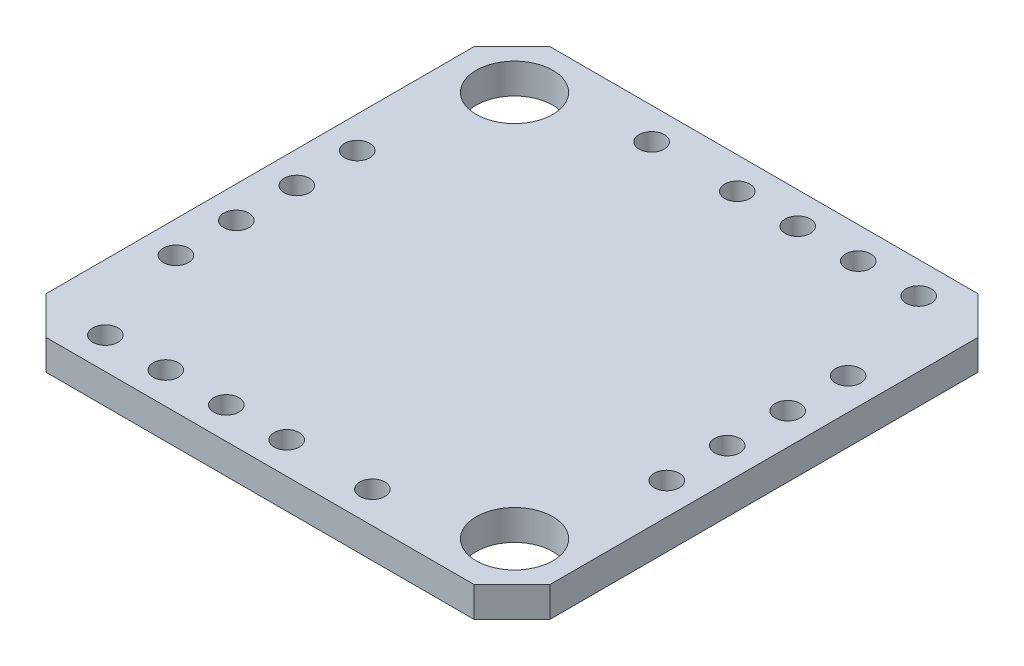
ISO-10303-21;
HEADER;
FILE_DESCRIPTION(('STEP AP214'),'2;1');
FILE_NAME('part.step','',(''),(''),'','','');
FILE_SCHEMA(('AUTOMOTIVE_DESIGN { 1 0 10303 214 1 1 1 1 }'));
ENDSEC;
DATA;
#1=APPLICATION_CONTEXT('core data for automotive mechanical design processes');
#2=APPLICATION_PROTOCOL_DEFINITION('international standard','automotive_design',2000,#1);
#3=PRODUCT_CONTEXT('',#1,'mechanical');
#4=PRODUCT('Part','Part','',(#3));
#5=PRODUCT_RELATED_PRODUCT_CATEGORY('part','',(#4));
#6=PRODUCT_DEFINITION_FORMATION('','',#4);
#7=PRODUCT_DEFINITION_CONTEXT('part definition',#1,'design');
#8=PRODUCT_DEFINITION('design','',#6,#7);
#9=PRODUCT_DEFINITION_SHAPE('','',#8);
#10=(LENGTH_UNIT() NAMED_UNIT(*) SI_UNIT(.MILLI.,.METRE.));
#11=(NAMED_UNIT(*) PLANE_ANGLE_UNIT() SI_UNIT($,.RADIAN.));
#12=(NAMED_UNIT(*) SI_UNIT($,.STERADIAN.) SOLID_ANGLE_UNIT());
#13=UNCERTAINTY_MEASURE_WITH_UNIT(LENGTH_MEASURE(1.E-05),#10,'distance_accuracy_value','');
#14=(GEOMETRIC_REPRESENTATION_CONTEXT(3) GLOBAL_UNCERTAINTY_ASSIGNED_CONTEXT((#13)) GLOBAL_UNIT_ASSIGNED_CONTEXT((#10,
#11,#12)) REPRESENTATION_CONTEXT('',''));
#15=CARTESIAN_POINT('',(0.,0.,0.));
#16=DIRECTION('',(0.,0.,1.));
#17=DIRECTION('',(1.,0.,0.));
#18=AXIS2_PLACEMENT_3D('',#15,#16,#17);
#19=CARTESIAN_POINT('',(5.,0.6,5.));
#20=DIRECTION('',(-1.,0.,0.));
#21=DIRECTION('',(0.,0.,1.));
#22=AXIS2_PLACEMENT_3D('',#19,#20,#21);
#23=PLANE('',#22);
#24=DIRECTION('',(0.,0.,-1.));
#25=VECTOR('',#24,1.);
#26=CARTESIAN_POINT('',(5.,0.6,5.));
#27=LINE('',#26,#25);
#28=CARTESIAN_POINT('',(5.,0.6,4.25));
#29=VERTEX_POINT('',#28);
#30=CARTESIAN_POINT('',(5.,0.6,-4.25));
#31=VERTEX_POINT('',#30);
#32=EDGE_CURVE('E126',#29,#31,#27,.T.);
#33=ORIENTED_EDGE('',*,*,#32,.F.);
#34=DIRECTION('',(0.,-1.,0.));
#35=VECTOR('',#34,1.);
#36=CARTESIAN_POINT('',(5.,0.6,4.25));
#37=LINE('',#36,#35);
#38=CARTESIAN_POINT('',(5.,0.,4.25));
#39=VERTEX_POINT('',#38);
#40=EDGE_CURVE('E152',#29,#39,#37,.T.);
#41=ORIENTED_EDGE('',*,*,#40,.T.);
#42=DIRECTION('',(0.,0.,-1.));
#43=VECTOR('',#42,1.);
#44=CARTESIAN_POINT('',(5.,0.,5.));
#45=LINE('',#44,#43);
#46=CARTESIAN_POINT('',(5.,0.,-4.25));
#47=VERTEX_POINT('',#46);
#48=EDGE_CURVE('E158',#39,#47,#45,.T.);
#49=ORIENTED_EDGE('',*,*,#48,.T.);
#50=DIRECTION('',(0.,1.,0.));
#51=VECTOR('',#50,1.);
#52=CARTESIAN_POINT('',(5.,0.6,-4.25));
#53=LINE('',#52,#51);
#54=EDGE_CURVE('E150',#47,#31,#53,.T.);
#55=ORIENTED_EDGE('',*,*,#54,.T.);
#56=EDGE_LOOP('',(#33,#41,#49,#55));
#57=FACE_BOUND('',#56,.T.);
#58=ADVANCED_FACE('F34',(#57),#23,.F.);
#59=CARTESIAN_POINT('',(-5.,0.6,-5.));
#60=DIRECTION('',(0.,0.,1.));
#61=DIRECTION('',(1.,0.,0.));
#62=AXIS2_PLACEMENT_3D('',#59,#60,#61);
#63=PLANE('',#62);
#64=DIRECTION('',(-1.,0.,0.));
#65=VECTOR('',#64,1.);
#66=CARTESIAN_POINT('',(-5.,0.6,-5.));
#67=LINE('',#66,#65);
#68=CARTESIAN_POINT('',(4.25,0.6,-5.));
#69=VERTEX_POINT('',#68);
#70=CARTESIAN_POINT('',(-4.24999999999999,0.6,-5.));
#71=VERTEX_POINT('',#70);
#72=EDGE_CURVE('E129',#69,#71,#67,.T.);
#73=ORIENTED_EDGE('',*,*,#72,.F.);
#74=DIRECTION('',(0.,-1.,0.));
#75=VECTOR('',#74,1.);
#76=CARTESIAN_POINT('',(4.25,0.6,-5.));
#77=LINE('',#76,#75);
#78=CARTESIAN_POINT('',(4.25,0.,-5.));
#79=VERTEX_POINT('',#78);
#80=EDGE_CURVE('E11',#69,#79,#77,.T.);
#81=ORIENTED_EDGE('',*,*,#80,.T.);
#82=DIRECTION('',(-1.,0.,0.));
#83=VECTOR('',#82,1.);
#84=CARTESIAN_POINT('',(-5.,0.,-5.));
#85=LINE('',#84,#83);
#86=CARTESIAN_POINT('',(-4.24999999999999,0.,-5.));
#87=VERTEX_POINT('',#86);
#88=EDGE_CURVE('E131',#79,#87,#85,.T.);
#89=ORIENTED_EDGE('',*,*,#88,.T.);
#90=DIRECTION('',(0.,1.,0.));
#91=VECTOR('',#90,1.);
#92=CARTESIAN_POINT('',(-4.24999999999999,0.6,-5.));
#93=LINE('',#92,#91);
#94=EDGE_CURVE('E42',#87,#71,#93,.T.);
#95=ORIENTED_EDGE('',*,*,#94,.T.);
#96=EDGE_LOOP('',(#73,#81,#89,#95));
#97=FACE_BOUND('',#96,.T.);
#98=ADVANCED_FACE('F347',(#97),#63,.F.);
#99=CARTESIAN_POINT('',(-5.,0.6,5.));
#100=DIRECTION('',(1.,0.,0.));
#101=DIRECTION('',(0.,0.,-1.));
#102=AXIS2_PLACEMENT_3D('',#99,#100,#101);
#103=PLANE('',#102);
#104=DIRECTION('',(0.,0.,1.));
#105=VECTOR('',#104,1.);
#106=CARTESIAN_POINT('',(-5.,0.,5.));
#107=LINE('',#106,#105);
#108=CARTESIAN_POINT('',(-5.,0.,-4.25));
#109=VERTEX_POINT('',#108);
#110=CARTESIAN_POINT('',(-5.,0.,4.25));
#111=VERTEX_POINT('',#110);
#112=EDGE_CURVE('E127',#109,#111,#107,.T.);
#113=ORIENTED_EDGE('',*,*,#112,.T.);
#114=DIRECTION('',(0.,1.,0.));
#115=VECTOR('',#114,1.);
#116=CARTESIAN_POINT('',(-5.,0.6,4.25));
#117=LINE('',#116,#115);
#118=CARTESIAN_POINT('',(-5.,0.6,4.25));
#119=VERTEX_POINT('',#118);
#120=EDGE_CURVE('E105',#111,#119,#117,.T.);
#121=ORIENTED_EDGE('',*,*,#120,.T.);
#122=DIRECTION('',(0.,0.,1.));
#123=VECTOR('',#122,1.);
#124=CARTESIAN_POINT('',(-5.,0.6,5.));
#125=LINE('',#124,#123);
#126=CARTESIAN_POINT('',(-5.,0.6,-4.25));
#127=VERTEX_POINT('',#126);
#128=EDGE_CURVE('E170',#127,#119,#125,.T.);
#129=ORIENTED_EDGE('',*,*,#128,.F.);
#130=DIRECTION('',(0.,-1.,0.));
#131=VECTOR('',#130,1.);
#132=CARTESIAN_POINT('',(-5.,0.6,-4.25));
#133=LINE('',#132,#131);
#134=EDGE_CURVE('E110',#127,#109,#133,.T.);
#135=ORIENTED_EDGE('',*,*,#134,.T.);
#136=EDGE_LOOP('',(#113,#121,#129,#135));
#137=FACE_BOUND('',#136,.T.);
#138=ADVANCED_FACE('F345',(#137),#103,.F.);
#139=CARTESIAN_POINT('',(-5.,0.6,5.));
#140=DIRECTION('',(0.,0.,-1.));
#141=DIRECTION('',(-1.,0.,0.));
#142=AXIS2_PLACEMENT_3D('',#139,#140,#141);
#143=PLANE('',#142);
#144=DIRECTION('',(1.,0.,0.));
#145=VECTOR('',#144,1.);
#146=CARTESIAN_POINT('',(-5.,0.6,5.));
#147=LINE('',#146,#145);
#148=CARTESIAN_POINT('',(-4.25,0.6,5.));
#149=VERTEX_POINT('',#148);
#150=CARTESIAN_POINT('',(4.25,0.6,5.));
#151=VERTEX_POINT('',#150);
#152=EDGE_CURVE('E120',#149,#151,#147,.T.);
#153=ORIENTED_EDGE('',*,*,#152,.F.);
#154=DIRECTION('',(0.,-1.,0.));
#155=VECTOR('',#154,1.);
#156=CARTESIAN_POINT('',(-4.25,0.6,5.));
#157=LINE('',#156,#155);
#158=CARTESIAN_POINT('',(-4.25,0.,5.));
#159=VERTEX_POINT('',#158);
#160=EDGE_CURVE('E104',#149,#159,#157,.T.);
#161=ORIENTED_EDGE('',*,*,#160,.T.);
#162=DIRECTION('',(1.,0.,0.));
#163=VECTOR('',#162,1.);
#164=CARTESIAN_POINT('',(-5.,0.,5.));
#165=LINE('',#164,#163);
#166=CARTESIAN_POINT('',(4.25,0.,5.));
#167=VERTEX_POINT('',#166);
#168=EDGE_CURVE('E117',#159,#167,#165,.T.);
#169=ORIENTED_EDGE('',*,*,#168,.T.);
#170=DIRECTION('',(0.,1.,0.));
#171=VECTOR('',#170,1.);
#172=CARTESIAN_POINT('',(4.25,0.6,5.));
#173=LINE('',#172,#171);
#174=EDGE_CURVE('E122',#167,#151,#173,.T.);
#175=ORIENTED_EDGE('',*,*,#174,.T.);
#176=EDGE_LOOP('',(#153,#161,#169,#175));
#177=FACE_BOUND('',#176,.T.);
#178=ADVANCED_FACE('F116',(#177),#143,.F.);
#179=CARTESIAN_POINT('',(0.,0.6,0.));
#180=DIRECTION('',(0.,-1.,0.));
#181=DIRECTION('',(0.,0.,-1.));
#182=AXIS2_PLACEMENT_3D('',#179,#180,#181);
#183=PLANE('',#182);
#184=CARTESIAN_POINT('',(4.3718272,0.6,1.3));
#185=DIRECTION('',(0.,1.,0.));
#186=DIRECTION('',(0.,0.,1.));
#187=AXIS2_PLACEMENT_3D('',#184,#185,#186);
#188=CIRCLE('',#187,0.25);
#189=CARTESIAN_POINT('',(4.3718272,0.6,1.55));
#190=VERTEX_POINT('',#189);
#191=EDGE_CURVE('E270',#190,#190,#188,.T.);
#192=ORIENTED_EDGE('',*,*,#191,.F.);
#193=EDGE_LOOP('',(#192));
#194=FACE_BOUND('',#193,.T.);
#195=CARTESIAN_POINT('',(4.3718272,0.6,-1.1));
#196=DIRECTION('',(0.,1.,0.));
#197=DIRECTION('',(0.,0.,1.));
#198=AXIS2_PLACEMENT_3D('',#195,#196,#197);
#199=CIRCLE('',#198,0.25);
#200=CARTESIAN_POINT('',(4.3718272,0.6,-0.849999999999999));
#201=VERTEX_POINT('',#200);
#202=EDGE_CURVE('E280',#201,#201,#199,.T.);
#203=ORIENTED_EDGE('',*,*,#202,.F.);
#204=EDGE_LOOP('',(#203));
#205=FACE_BOUND('',#204,.T.);
#206=CARTESIAN_POINT('',(4.3718272,0.6,-2.3));
#207=DIRECTION('',(0.,1.,0.));
#208=DIRECTION('',(0.,0.,1.));
#209=AXIS2_PLACEMENT_3D('',#206,#207,#208);
#210=CIRCLE('',#209,0.25);
#211=CARTESIAN_POINT('',(4.3718272,0.6,-2.05));
#212=VERTEX_POINT('',#211);
#213=EDGE_CURVE('E273',#212,#212,#210,.T.);
#214=ORIENTED_EDGE('',*,*,#213,.F.);
#215=EDGE_LOOP('',(#214));
#216=FACE_BOUND('',#215,.T.);
#217=CARTESIAN_POINT('',(4.3718272,0.6,0.1));
#218=DIRECTION('',(0.,1.,0.));
#219=DIRECTION('',(0.,0.,1.));
#220=AXIS2_PLACEMENT_3D('',#217,#218,#219);
#221=CIRCLE('',#220,0.25);
#222=CARTESIAN_POINT('',(4.3718272,0.6,0.35));
#223=VERTEX_POINT('',#222);
#224=EDGE_CURVE('E264',#223,#223,#221,.T.);
#225=ORIENTED_EDGE('',*,*,#224,.F.);
#226=EDGE_LOOP('',(#225));
#227=FACE_BOUND('',#226,.T.);
#228=CARTESIAN_POINT('',(-1.6,0.6,-4.3718272));
#229=DIRECTION('',(0.,1.,0.));
#230=DIRECTION('',(0.,0.,1.));
#231=AXIS2_PLACEMENT_3D('',#228,#229,#230);
#232=CIRCLE('',#231,0.25);
#233=CARTESIAN_POINT('',(-1.6,0.6,-4.1218272));
#234=VERTEX_POINT('',#233);
#235=EDGE_CURVE('E258',#234,#234,#232,.T.);
#236=ORIENTED_EDGE('',*,*,#235,.F.);
#237=EDGE_LOOP('',(#236));
#238=FACE_BOUND('',#237,.T.);
#239=CARTESIAN_POINT('',(1.6,0.6,4.3718272));
#240=DIRECTION('',(0.,1.,0.));
#241=DIRECTION('',(0.,0.,1.));
#242=AXIS2_PLACEMENT_3D('',#239,#240,#241);
#243=CIRCLE('',#242,0.25);
#244=CARTESIAN_POINT('',(1.6,0.6,4.6218272));
#245=VERTEX_POINT('',#244);
#246=EDGE_CURVE('E244',#245,#245,#243,.T.);
#247=ORIENTED_EDGE('',*,*,#246,.F.);
#248=EDGE_LOOP('',(#247));
#249=FACE_BOUND('',#248,.T.);
#250=CARTESIAN_POINT('',(3.7,0.6,-4.3718272));
#251=DIRECTION('',(0.,1.,0.));
#252=DIRECTION('',(0.,0.,1.));
#253=AXIS2_PLACEMENT_3D('',#250,#251,#252);
#254=CIRCLE('',#253,0.25);
#255=CARTESIAN_POINT('',(3.7,0.6,-4.1218272));
#256=VERTEX_POINT('',#255);
#257=EDGE_CURVE('E234',#256,#256,#254,.T.);
#258=ORIENTED_EDGE('',*,*,#257,.F.);
#259=EDGE_LOOP('',(#258));
#260=FACE_BOUND('',#259,.T.);
#261=CARTESIAN_POINT('',(1.3,0.6,-4.3718272));
#262=DIRECTION('',(0.,1.,0.));
#263=DIRECTION('',(0.,0.,1.));
#264=AXIS2_PLACEMENT_3D('',#261,#262,#263);
#265=CIRCLE('',#264,0.25);
#266=CARTESIAN_POINT('',(1.3,0.6,-4.1218272));
#267=VERTEX_POINT('',#266);
#268=EDGE_CURVE('E245',#267,#267,#265,.T.);
#269=ORIENTED_EDGE('',*,*,#268,.F.);
#270=EDGE_LOOP('',(#269));
#271=FACE_BOUND('',#270,.T.);
#272=CARTESIAN_POINT('',(0.1,0.6,-4.3718272));
#273=DIRECTION('',(0.,1.,0.));
#274=DIRECTION('',(0.,0.,1.));
#275=AXIS2_PLACEMENT_3D('',#272,#273,#274);
#276=CIRCLE('',#275,0.25);
#277=CARTESIAN_POINT('',(0.1,0.6,-4.1218272));
#278=VERTEX_POINT('',#277);
#279=EDGE_CURVE('E237',#278,#278,#276,.T.);
#280=ORIENTED_EDGE('',*,*,#279,.F.);
#281=EDGE_LOOP('',(#280));
#282=FACE_BOUND('',#281,.T.);
#283=CARTESIAN_POINT('',(2.5,0.6,-4.3718272));
#284=DIRECTION('',(0.,1.,0.));
#285=DIRECTION('',(0.,0.,1.));
#286=AXIS2_PLACEMENT_3D('',#283,#284,#285);
#287=CIRCLE('',#286,0.25);
#288=CARTESIAN_POINT('',(2.5,0.6,-4.1218272));
#289=VERTEX_POINT('',#288);
#290=EDGE_CURVE('E220',#289,#289,#287,.T.);
#291=ORIENTED_EDGE('',*,*,#290,.F.);
#292=EDGE_LOOP('',(#291));
#293=FACE_BOUND('',#292,.T.);
#294=CARTESIAN_POINT('',(-3.7,0.6,4.3718272));
#295=DIRECTION('',(0.,1.,0.));
#296=DIRECTION('',(0.,0.,1.));
#297=AXIS2_PLACEMENT_3D('',#294,#295,#296);
#298=CIRCLE('',#297,0.250000000000001);
#299=CARTESIAN_POINT('',(-3.7,0.6,4.6218272));
#300=VERTEX_POINT('',#299);
#301=EDGE_CURVE('E210',#300,#300,#298,.T.);
#302=ORIENTED_EDGE('',*,*,#301,.F.);
#303=EDGE_LOOP('',(#302));
#304=FACE_BOUND('',#303,.T.);
#305=CARTESIAN_POINT('',(-1.3,0.6,4.3718272));
#306=DIRECTION('',(0.,1.,0.));
#307=DIRECTION('',(0.,0.,1.));
#308=AXIS2_PLACEMENT_3D('',#305,#306,#307);
#309=CIRCLE('',#308,0.250000000000001);
#310=CARTESIAN_POINT('',(-1.3,0.6,4.6218272));
#311=VERTEX_POINT('',#310);
#312=EDGE_CURVE('E221',#311,#311,#309,.T.);
#313=ORIENTED_EDGE('',*,*,#312,.F.);
#314=EDGE_LOOP('',(#313));
#315=FACE_BOUND('',#314,.T.);
#316=CARTESIAN_POINT('',(-0.1,0.6,4.3718272));
#317=DIRECTION('',(0.,1.,0.));
#318=DIRECTION('',(0.,0.,1.));
#319=AXIS2_PLACEMENT_3D('',#316,#317,#318);
#320=CIRCLE('',#319,0.250000000000001);
#321=CARTESIAN_POINT('',(-0.1,0.6,4.6218272));
#322=VERTEX_POINT('',#321);
#323=EDGE_CURVE('E213',#322,#322,#320,.T.);
#324=ORIENTED_EDGE('',*,*,#323,.F.);
#325=EDGE_LOOP('',(#324));
#326=FACE_BOUND('',#325,.T.);
#327=CARTESIAN_POINT('',(-2.5,0.6,4.3718272));
#328=DIRECTION('',(0.,1.,0.));
#329=DIRECTION('',(0.,0.,1.));
#330=AXIS2_PLACEMENT_3D('',#327,#328,#329);
#331=CIRCLE('',#330,0.250000000000001);
#332=CARTESIAN_POINT('',(-2.5,0.6,4.6218272));
#333=VERTEX_POINT('',#332);
#334=EDGE_CURVE('E204',#333,#333,#331,.T.);
#335=ORIENTED_EDGE('',*,*,#334,.F.);
#336=EDGE_LOOP('',(#335));
#337=FACE_BOUND('',#336,.T.);
#338=CARTESIAN_POINT('',(3.86182720163546,0.6,3.81182720163548));
#339=DIRECTION('',(0.,-1.,0.));
#340=DIRECTION('',(-1.,0.,0.));
#341=AXIS2_PLACEMENT_3D('',#338,#339,#340);
#342=CIRCLE('',#341,0.76);
#343=CARTESIAN_POINT('',(3.10182720163546,0.6,3.81182720163547));
#344=VERTEX_POINT('',#343);
#345=EDGE_CURVE('E201',#344,#344,#342,.T.);
#346=ORIENTED_EDGE('',*,*,#345,.T.);
#347=EDGE_LOOP('',(#346));
#348=FACE_BOUND('',#347,.T.);
#349=CARTESIAN_POINT('',(-4.3718272,0.6,-1.3));
#350=DIRECTION('',(0.,1.,0.));
#351=DIRECTION('',(0.,0.,1.));
#352=AXIS2_PLACEMENT_3D('',#349,#350,#351);
#353=CIRCLE('',#352,0.25);
#354=CARTESIAN_POINT('',(-4.3718272,0.6,-1.05));
#355=VERTEX_POINT('',#354);
#356=EDGE_CURVE('E180',#355,#355,#353,.T.);
#357=ORIENTED_EDGE('',*,*,#356,.F.);
#358=EDGE_LOOP('',(#357));
#359=FACE_BOUND('',#358,.T.);
#360=CARTESIAN_POINT('',(-4.3718272,0.6,1.1));
#361=DIRECTION('',(0.,1.,0.));
#362=DIRECTION('',(0.,0.,1.));
#363=AXIS2_PLACEMENT_3D('',#360,#361,#362);
#364=CIRCLE('',#363,0.25);
#365=CARTESIAN_POINT('',(-4.3718272,0.6,1.35));
#366=VERTEX_POINT('',#365);
#367=EDGE_CURVE('E191',#366,#366,#364,.T.);
#368=ORIENTED_EDGE('',*,*,#367,.F.);
#369=EDGE_LOOP('',(#368));
#370=FACE_BOUND('',#369,.T.);
#371=CARTESIAN_POINT('',(-4.3718272,0.6,2.3));
#372=DIRECTION('',(0.,1.,0.));
#373=DIRECTION('',(0.,0.,1.));
#374=AXIS2_PLACEMENT_3D('',#371,#372,#373);
#375=CIRCLE('',#374,0.25);
#376=CARTESIAN_POINT('',(-4.3718272,0.6,2.55));
#377=VERTEX_POINT('',#376);
#378=EDGE_CURVE('E183',#377,#377,#375,.T.);
#379=ORIENTED_EDGE('',*,*,#378,.F.);
#380=EDGE_LOOP('',(#379));
#381=FACE_BOUND('',#380,.T.);
#382=CARTESIAN_POINT('',(-4.3718272,0.6,-0.1));
#383=DIRECTION('',(0.,1.,0.));
#384=DIRECTION('',(0.,0.,1.));
#385=AXIS2_PLACEMENT_3D('',#382,#383,#384);
#386=CIRCLE('',#385,0.25);
#387=CARTESIAN_POINT('',(-4.3718272,0.6,0.15));
#388=VERTEX_POINT('',#387);
#389=EDGE_CURVE('E175',#388,#388,#386,.T.);
#390=ORIENTED_EDGE('',*,*,#389,.F.);
#391=EDGE_LOOP('',(#390));
#392=FACE_BOUND('',#391,.T.);
#393=CARTESIAN_POINT('',(-3.81182720163547,0.6,-3.86182720163547));
#394=DIRECTION('',(0.,1.,0.));
#395=DIRECTION('',(0.,0.,1.));
#396=AXIS2_PLACEMENT_3D('',#393,#394,#395);
#397=CIRCLE('',#396,0.76);
#398=CARTESIAN_POINT('',(-3.81182720163547,0.6,-3.10182720163547));
#399=VERTEX_POINT('',#398);
#400=EDGE_CURVE('E166',#399,#399,#397,.T.);
#401=ORIENTED_EDGE('',*,*,#400,.F.);
#402=EDGE_LOOP('',(#401));
#403=FACE_BOUND('',#402,.T.);
#404=ORIENTED_EDGE('',*,*,#128,.T.);
#405=DIRECTION('',(-0.707106781186546,0.,-0.707106781186549));
#406=VECTOR('',#405,1.);
#407=CARTESIAN_POINT('',(-4.25,0.6,5.));
#408=LINE('',#407,#406);
#409=EDGE_CURVE('E148',#119,#149,#408,.F.);
#410=ORIENTED_EDGE('',*,*,#409,.T.);
#411=ORIENTED_EDGE('',*,*,#152,.T.);
#412=DIRECTION('',(-0.707106781186549,0.,0.707106781186546));
#413=VECTOR('',#412,1.);
#414=CARTESIAN_POINT('',(5.,0.6,4.25));
#415=LINE('',#414,#413);
#416=EDGE_CURVE('E146',#151,#29,#415,.F.);
#417=ORIENTED_EDGE('',*,*,#416,.T.);
#418=ORIENTED_EDGE('',*,*,#32,.T.);
#419=DIRECTION('',(0.707106781186546,0.,0.707106781186549));
#420=VECTOR('',#419,1.);
#421=CARTESIAN_POINT('',(4.25,0.6,-5.));
#422=LINE('',#421,#420);
#423=EDGE_CURVE('E55',#31,#69,#422,.F.);
#424=ORIENTED_EDGE('',*,*,#423,.T.);
#425=ORIENTED_EDGE('',*,*,#72,.T.);
#426=DIRECTION('',(0.707106781186549,0.,-0.707106781186546));
#427=VECTOR('',#426,1.);
#428=CARTESIAN_POINT('',(-5.,0.6,-4.25));
#429=LINE('',#428,#427);
#430=EDGE_CURVE('E143',#71,#127,#429,.F.);
#431=ORIENTED_EDGE('',*,*,#430,.T.);
#432=EDGE_LOOP('',(#404,#410,#411,#417,#418,#424,#425,#431));
#433=FACE_BOUND('',#432,.T.);
#434=ADVANCED_FACE('F300',(#194,#205,#216,#227,#238,#249,#260,#271,#282,#293,#304,#315,#326,
#337,#348,#359,#370,#381,#392,#403,#433),#183,.F.);
#435=CARTESIAN_POINT('',(0.,0.,0.));
#436=DIRECTION('',(0.,-1.,0.));
#437=DIRECTION('',(0.,0.,-1.));
#438=AXIS2_PLACEMENT_3D('',#435,#436,#437);
#439=PLANE('',#438);
#440=CARTESIAN_POINT('',(4.3718272,0.,1.3));
#441=DIRECTION('',(0.,-1.,0.));
#442=DIRECTION('',(0.,0.,-1.));
#443=AXIS2_PLACEMENT_3D('',#440,#441,#442);
#444=CIRCLE('',#443,0.25);
#445=CARTESIAN_POINT('',(4.3718272,0.,1.05));
#446=VERTEX_POINT('',#445);
#447=EDGE_CURVE('E283',#446,#446,#444,.F.);
#448=ORIENTED_EDGE('',*,*,#447,.T.);
#449=EDGE_LOOP('',(#448));
#450=FACE_BOUND('',#449,.T.);
#451=CARTESIAN_POINT('',(4.3718272,0.,-1.1));
#452=DIRECTION('',(0.,-1.,0.));
#453=DIRECTION('',(0.,0.,-1.));
#454=AXIS2_PLACEMENT_3D('',#451,#452,#453);
#455=CIRCLE('',#454,0.25);
#456=CARTESIAN_POINT('',(4.3718272,0.,-1.35));
#457=VERTEX_POINT('',#456);
#458=EDGE_CURVE('E276',#457,#457,#455,.F.);
#459=ORIENTED_EDGE('',*,*,#458,.T.);
#460=EDGE_LOOP('',(#459));
#461=FACE_BOUND('',#460,.T.);
#462=CARTESIAN_POINT('',(4.3718272,0.,-2.3));
#463=DIRECTION('',(0.,-1.,0.));
#464=DIRECTION('',(0.,0.,-1.));
#465=AXIS2_PLACEMENT_3D('',#462,#463,#464);
#466=CIRCLE('',#465,0.25);
#467=CARTESIAN_POINT('',(4.3718272,0.,-2.55));
#468=VERTEX_POINT('',#467);
#469=EDGE_CURVE('E277',#468,#468,#466,.F.);
#470=ORIENTED_EDGE('',*,*,#469,.T.);
#471=EDGE_LOOP('',(#470));
#472=FACE_BOUND('',#471,.T.);
#473=CARTESIAN_POINT('',(4.3718272,0.,0.1));
#474=DIRECTION('',(0.,-1.,0.));
#475=DIRECTION('',(0.,0.,-1.));
#476=AXIS2_PLACEMENT_3D('',#473,#474,#475);
#477=CIRCLE('',#476,0.25);
#478=CARTESIAN_POINT('',(4.3718272,0.,-0.15));
#479=VERTEX_POINT('',#478);
#480=EDGE_CURVE('E267',#479,#479,#477,.F.);
#481=ORIENTED_EDGE('',*,*,#480,.T.);
#482=EDGE_LOOP('',(#481));
#483=FACE_BOUND('',#482,.T.);
#484=CARTESIAN_POINT('',(-1.6,0.,-4.3718272));
#485=DIRECTION('',(0.,-1.,0.));
#486=DIRECTION('',(0.,0.,-1.));
#487=AXIS2_PLACEMENT_3D('',#484,#485,#486);
#488=CIRCLE('',#487,0.25);
#489=CARTESIAN_POINT('',(-1.6,0.,-4.6218272));
#490=VERTEX_POINT('',#489);
#491=EDGE_CURVE('E261',#490,#490,#488,.F.);
#492=ORIENTED_EDGE('',*,*,#491,.T.);
#493=EDGE_LOOP('',(#492));
#494=FACE_BOUND('',#493,.T.);
#495=CARTESIAN_POINT('',(1.6,0.,4.3718272));
#496=DIRECTION('',(0.,-1.,0.));
#497=DIRECTION('',(0.,0.,-1.));
#498=AXIS2_PLACEMENT_3D('',#495,#496,#497);
#499=CIRCLE('',#498,0.25);
#500=CARTESIAN_POINT('',(1.6,0.,4.1218272));
#501=VERTEX_POINT('',#500);
#502=EDGE_CURVE('E255',#501,#501,#499,.F.);
#503=ORIENTED_EDGE('',*,*,#502,.T.);
#504=EDGE_LOOP('',(#503));
#505=FACE_BOUND('',#504,.T.);
#506=CARTESIAN_POINT('',(3.7,0.,-4.3718272));
#507=DIRECTION('',(0.,-1.,0.));
#508=DIRECTION('',(0.,0.,-1.));
#509=AXIS2_PLACEMENT_3D('',#506,#507,#508);
#510=CIRCLE('',#509,0.25);
#511=CARTESIAN_POINT('',(3.7,0.,-4.6218272));
#512=VERTEX_POINT('',#511);
#513=EDGE_CURVE('E248',#512,#512,#510,.F.);
#514=ORIENTED_EDGE('',*,*,#513,.T.);
#515=EDGE_LOOP('',(#514));
#516=FACE_BOUND('',#515,.T.);
#517=CARTESIAN_POINT('',(1.3,0.,-4.3718272));
#518=DIRECTION('',(0.,-1.,0.));
#519=DIRECTION('',(0.,0.,-1.));
#520=AXIS2_PLACEMENT_3D('',#517,#518,#519);
#521=CIRCLE('',#520,0.25);
#522=CARTESIAN_POINT('',(1.3,0.,-4.6218272));
#523=VERTEX_POINT('',#522);
#524=EDGE_CURVE('E240',#523,#523,#521,.F.);
#525=ORIENTED_EDGE('',*,*,#524,.T.);
#526=EDGE_LOOP('',(#525));
#527=FACE_BOUND('',#526,.T.);
#528=CARTESIAN_POINT('',(0.1,0.,-4.3718272));
#529=DIRECTION('',(0.,-1.,0.));
#530=DIRECTION('',(0.,0.,-1.));
#531=AXIS2_PLACEMENT_3D('',#528,#529,#530);
#532=CIRCLE('',#531,0.25);
#533=CARTESIAN_POINT('',(0.1,0.,-4.6218272));
#534=VERTEX_POINT('',#533);
#535=EDGE_CURVE('E241',#534,#534,#532,.F.);
#536=ORIENTED_EDGE('',*,*,#535,.T.);
#537=EDGE_LOOP('',(#536));
#538=FACE_BOUND('',#537,.T.);
#539=CARTESIAN_POINT('',(2.5,0.,-4.3718272));
#540=DIRECTION('',(0.,-1.,0.));
#541=DIRECTION('',(0.,0.,-1.));
#542=AXIS2_PLACEMENT_3D('',#539,#540,#541);
#543=CIRCLE('',#542,0.25);
#544=CARTESIAN_POINT('',(2.5,0.,-4.6218272));
#545=VERTEX_POINT('',#544);
#546=EDGE_CURVE('E231',#545,#545,#543,.F.);
#547=ORIENTED_EDGE('',*,*,#546,.T.);
#548=EDGE_LOOP('',(#547));
#549=FACE_BOUND('',#548,.T.);
#550=CARTESIAN_POINT('',(-3.7,0.,4.3718272));
#551=DIRECTION('',(0.,-1.,0.));
#552=DIRECTION('',(0.,0.,-1.));
#553=AXIS2_PLACEMENT_3D('',#550,#551,#552);
#554=CIRCLE('',#553,0.250000000000001);
#555=CARTESIAN_POINT('',(-3.7,0.,4.1218272));
#556=VERTEX_POINT('',#555);
#557=EDGE_CURVE('E224',#556,#556,#554,.F.);
#558=ORIENTED_EDGE('',*,*,#557,.T.);
#559=EDGE_LOOP('',(#558));
#560=FACE_BOUND('',#559,.T.);
#561=CARTESIAN_POINT('',(-1.3,0.,4.3718272));
#562=DIRECTION('',(0.,-1.,0.));
#563=DIRECTION('',(0.,0.,-1.));
#564=AXIS2_PLACEMENT_3D('',#561,#562,#563);
#565=CIRCLE('',#564,0.250000000000001);
#566=CARTESIAN_POINT('',(-1.3,0.,4.1218272));
#567=VERTEX_POINT('',#566);
#568=EDGE_CURVE('E216',#567,#567,#565,.F.);
#569=ORIENTED_EDGE('',*,*,#568,.T.);
#570=EDGE_LOOP('',(#569));
#571=FACE_BOUND('',#570,.T.);
#572=CARTESIAN_POINT('',(-0.1,0.,4.3718272));
#573=DIRECTION('',(0.,-1.,0.));
#574=DIRECTION('',(0.,0.,-1.));
#575=AXIS2_PLACEMENT_3D('',#572,#573,#574);
#576=CIRCLE('',#575,0.250000000000001);
#577=CARTESIAN_POINT('',(-0.1,0.,4.1218272));
#578=VERTEX_POINT('',#577);
#579=EDGE_CURVE('E217',#578,#578,#576,.F.);
#580=ORIENTED_EDGE('',*,*,#579,.T.);
#581=EDGE_LOOP('',(#580));
#582=FACE_BOUND('',#581,.T.);
#583=CARTESIAN_POINT('',(-2.5,0.,4.3718272));
#584=DIRECTION('',(0.,-1.,0.));
#585=DIRECTION('',(0.,0.,-1.));
#586=AXIS2_PLACEMENT_3D('',#583,#584,#585);
#587=CIRCLE('',#586,0.250000000000001);
#588=CARTESIAN_POINT('',(-2.5,0.,4.1218272));
#589=VERTEX_POINT('',#588);
#590=EDGE_CURVE('E207',#589,#589,#587,.F.);
#591=ORIENTED_EDGE('',*,*,#590,.T.);
#592=EDGE_LOOP('',(#591));
#593=FACE_BOUND('',#592,.T.);
#594=CARTESIAN_POINT('',(3.86182720163546,0.,3.81182720163548));
#595=DIRECTION('',(0.,-1.,0.));
#596=DIRECTION('',(-1.,0.,0.));
#597=AXIS2_PLACEMENT_3D('',#594,#595,#596);
#598=CIRCLE('',#597,0.76);
#599=CARTESIAN_POINT('',(3.10182720163546,0.,3.81182720163547));
#600=VERTEX_POINT('',#599);
#601=EDGE_CURVE('E190',#600,#600,#598,.T.);
#602=ORIENTED_EDGE('',*,*,#601,.F.);
#603=EDGE_LOOP('',(#602));
#604=FACE_BOUND('',#603,.T.);
#605=CARTESIAN_POINT('',(-4.3718272,0.,-1.3));
#606=DIRECTION('',(0.,-1.,0.));
#607=DIRECTION('',(0.,0.,-1.));
#608=AXIS2_PLACEMENT_3D('',#605,#606,#607);
#609=CIRCLE('',#608,0.25);
#610=CARTESIAN_POINT('',(-4.3718272,0.,-1.55));
#611=VERTEX_POINT('',#610);
#612=EDGE_CURVE('E194',#611,#611,#609,.F.);
#613=ORIENTED_EDGE('',*,*,#612,.T.);
#614=EDGE_LOOP('',(#613));
#615=FACE_BOUND('',#614,.T.);
#616=CARTESIAN_POINT('',(-4.3718272,0.,1.1));
#617=DIRECTION('',(0.,-1.,0.));
#618=DIRECTION('',(0.,0.,-1.));
#619=AXIS2_PLACEMENT_3D('',#616,#617,#618);
#620=CIRCLE('',#619,0.25);
#621=CARTESIAN_POINT('',(-4.3718272,0.,0.849999999999999));
#622=VERTEX_POINT('',#621);
#623=EDGE_CURVE('E186',#622,#622,#620,.F.);
#624=ORIENTED_EDGE('',*,*,#623,.T.);
#625=EDGE_LOOP('',(#624));
#626=FACE_BOUND('',#625,.T.);
#627=CARTESIAN_POINT('',(-4.3718272,0.,2.3));
#628=DIRECTION('',(0.,-1.,0.));
#629=DIRECTION('',(0.,0.,-1.));
#630=AXIS2_PLACEMENT_3D('',#627,#628,#629);
#631=CIRCLE('',#630,0.25);
#632=CARTESIAN_POINT('',(-4.3718272,0.,2.05));
#633=VERTEX_POINT('',#632);
#634=EDGE_CURVE('E187',#633,#633,#631,.F.);
#635=ORIENTED_EDGE('',*,*,#634,.T.);
#636=EDGE_LOOP('',(#635));
#637=FACE_BOUND('',#636,.T.);
#638=CARTESIAN_POINT('',(-4.3718272,0.,-0.1));
#639=DIRECTION('',(0.,-1.,0.));
#640=DIRECTION('',(0.,0.,-1.));
#641=AXIS2_PLACEMENT_3D('',#638,#639,#640);
#642=CIRCLE('',#641,0.25);
#643=CARTESIAN_POINT('',(-4.3718272,0.,-0.35));
#644=VERTEX_POINT('',#643);
#645=EDGE_CURVE('E177',#644,#644,#642,.F.);
#646=ORIENTED_EDGE('',*,*,#645,.T.);
#647=EDGE_LOOP('',(#646));
#648=FACE_BOUND('',#647,.T.);
#649=CARTESIAN_POINT('',(-3.81182720163547,0.,-3.86182720163547));
#650=DIRECTION('',(0.,1.,0.));
#651=DIRECTION('',(0.,0.,1.));
#652=AXIS2_PLACEMENT_3D('',#649,#650,#651);
#653=CIRCLE('',#652,0.76);
#654=CARTESIAN_POINT('',(-3.81182720163547,0.,-3.10182720163547));
#655=VERTEX_POINT('',#654);
#656=EDGE_CURVE('E163',#655,#655,#653,.T.);
#657=ORIENTED_EDGE('',*,*,#656,.T.);
#658=EDGE_LOOP('',(#657));
#659=FACE_BOUND('',#658,.T.);
#660=ORIENTED_EDGE('',*,*,#168,.F.);
#661=DIRECTION('',(0.707106781186546,0.,0.707106781186549));
#662=VECTOR('',#661,1.);
#663=CARTESIAN_POINT('',(-4.62500000000001,0.,4.62499999999999));
#664=LINE('',#663,#662);
#665=EDGE_CURVE('E100',#159,#111,#664,.F.);
#666=ORIENTED_EDGE('',*,*,#665,.T.);
#667=ORIENTED_EDGE('',*,*,#112,.F.);
#668=DIRECTION('',(-0.707106781186549,0.,0.707106781186546));
#669=VECTOR('',#668,1.);
#670=CARTESIAN_POINT('',(-4.62499999999999,0.,-4.62500000000001));
#671=LINE('',#670,#669);
#672=EDGE_CURVE('E121',#109,#87,#671,.F.);
#673=ORIENTED_EDGE('',*,*,#672,.T.);
#674=ORIENTED_EDGE('',*,*,#88,.F.);
#675=DIRECTION('',(-0.707106781186546,0.,-0.707106781186549));
#676=VECTOR('',#675,1.);
#677=CARTESIAN_POINT('',(4.62500000000001,0.,-4.62499999999999));
#678=LINE('',#677,#676);
#679=EDGE_CURVE('E137',#79,#47,#678,.F.);
#680=ORIENTED_EDGE('',*,*,#679,.T.);
#681=ORIENTED_EDGE('',*,*,#48,.F.);
#682=DIRECTION('',(0.707106781186549,0.,-0.707106781186546));
#683=VECTOR('',#682,1.);
#684=CARTESIAN_POINT('',(4.62499999999999,0.,4.62500000000001));
#685=LINE('',#684,#683);
#686=EDGE_CURVE('E111',#39,#167,#685,.F.);
#687=ORIENTED_EDGE('',*,*,#686,.T.);
#688=EDGE_LOOP('',(#660,#666,#667,#673,#674,#680,#681,#687));
#689=FACE_BOUND('',#688,.T.);
#690=ADVANCED_FACE('F124',(#450,#461,#472,#483,#494,#505,#516,#527,#538,#549,#560,#571,#582,
#593,#604,#615,#626,#637,#648,#659,#689),#439,.T.);
#691=CARTESIAN_POINT('',(-4.25,0.6,5.));
#692=DIRECTION('',(0.707106781186549,0.,-0.707106781186546));
#693=DIRECTION('',(0.,-1.,0.));
#694=AXIS2_PLACEMENT_3D('',#691,#692,#693);
#695=PLANE('',#694);
#696=ORIENTED_EDGE('',*,*,#409,.F.);
#697=ORIENTED_EDGE('',*,*,#120,.F.);
#698=ORIENTED_EDGE('',*,*,#665,.F.);
#699=ORIENTED_EDGE('',*,*,#160,.F.);
#700=EDGE_LOOP('',(#696,#697,#698,#699));
#701=FACE_BOUND('',#700,.T.);
#702=ADVANCED_FACE('F103',(#701),#695,.F.);
#703=CARTESIAN_POINT('',(5.,0.6,4.25));
#704=DIRECTION('',(-0.707106781186546,0.,-0.707106781186549));
#705=DIRECTION('',(0.,-1.,0.));
#706=AXIS2_PLACEMENT_3D('',#703,#704,#705);
#707=PLANE('',#706);
#708=ORIENTED_EDGE('',*,*,#416,.F.);
#709=ORIENTED_EDGE('',*,*,#174,.F.);
#710=ORIENTED_EDGE('',*,*,#686,.F.);
#711=ORIENTED_EDGE('',*,*,#40,.F.);
#712=EDGE_LOOP('',(#708,#709,#710,#711));
#713=FACE_BOUND('',#712,.T.);
#714=ADVANCED_FACE('F351',(#713),#707,.F.);
#715=CARTESIAN_POINT('',(4.25,0.6,-5.));
#716=DIRECTION('',(-0.707106781186549,0.,0.707106781186546));
#717=DIRECTION('',(0.,-1.,0.));
#718=AXIS2_PLACEMENT_3D('',#715,#716,#717);
#719=PLANE('',#718);
#720=ORIENTED_EDGE('',*,*,#423,.F.);
#721=ORIENTED_EDGE('',*,*,#54,.F.);
#722=ORIENTED_EDGE('',*,*,#679,.F.);
#723=ORIENTED_EDGE('',*,*,#80,.F.);
#724=EDGE_LOOP('',(#720,#721,#722,#723));
#725=FACE_BOUND('',#724,.T.);
#726=ADVANCED_FACE('F350',(#725),#719,.F.);
#727=CARTESIAN_POINT('',(-5.,0.6,-4.25));
#728=DIRECTION('',(0.707106781186546,0.,0.707106781186549));
#729=DIRECTION('',(0.,-1.,0.));
#730=AXIS2_PLACEMENT_3D('',#727,#728,#729);
#731=PLANE('',#730);
#732=ORIENTED_EDGE('',*,*,#430,.F.);
#733=ORIENTED_EDGE('',*,*,#94,.F.);
#734=ORIENTED_EDGE('',*,*,#672,.F.);
#735=ORIENTED_EDGE('',*,*,#134,.F.);
#736=EDGE_LOOP('',(#732,#733,#734,#735));
#737=FACE_BOUND('',#736,.T.);
#738=ADVANCED_FACE('F36',(#737),#731,.F.);
#739=CARTESIAN_POINT('',(-3.81182720163547,0.,-3.86182720163547));
#740=DIRECTION('',(0.,1.,0.));
#741=DIRECTION('',(0.,0.,1.));
#742=AXIS2_PLACEMENT_3D('',#739,#740,#741);
#743=CYLINDRICAL_SURFACE('',#742,0.76);
#744=ORIENTED_EDGE('',*,*,#656,.F.);
#745=EDGE_LOOP('',(#744));
#746=FACE_BOUND('',#745,.T.);
#747=ORIENTED_EDGE('',*,*,#400,.T.);
#748=EDGE_LOOP('',(#747));
#749=FACE_BOUND('',#748,.T.);
#750=ADVANCED_FACE('F372',(#746,#749),#743,.F.);
#751=CARTESIAN_POINT('',(-4.3718272,-0.00100000000000002,-0.1));
#752=DIRECTION('',(0.,1.,0.));
#753=DIRECTION('',(0.,0.,1.));
#754=AXIS2_PLACEMENT_3D('',#751,#752,#753);
#755=CYLINDRICAL_SURFACE('',#754,0.25);
#756=ORIENTED_EDGE('',*,*,#645,.F.);
#757=EDGE_LOOP('',(#756));
#758=FACE_BOUND('',#757,.T.);
#759=ORIENTED_EDGE('',*,*,#389,.T.);
#760=EDGE_LOOP('',(#759));
#761=FACE_BOUND('',#760,.T.);
#762=ADVANCED_FACE('F375',(#758,#761),#755,.F.);
#763=CARTESIAN_POINT('',(-4.3718272,-0.00100000000000002,2.3));
#764=DIRECTION('',(0.,1.,0.));
#765=DIRECTION('',(0.,0.,1.));
#766=AXIS2_PLACEMENT_3D('',#763,#764,#765);
#767=CYLINDRICAL_SURFACE('',#766,0.25);
#768=ORIENTED_EDGE('',*,*,#634,.F.);
#769=EDGE_LOOP('',(#768));
#770=FACE_BOUND('',#769,.T.);
#771=ORIENTED_EDGE('',*,*,#378,.T.);
#772=EDGE_LOOP('',(#771));
#773=FACE_BOUND('',#772,.T.);
#774=ADVANCED_FACE('F379',(#770,#773),#767,.F.);
#775=CARTESIAN_POINT('',(-4.3718272,-0.00100000000000002,1.1));
#776=DIRECTION('',(0.,1.,0.));
#777=DIRECTION('',(0.,0.,1.));
#778=AXIS2_PLACEMENT_3D('',#775,#776,#777);
#779=CYLINDRICAL_SURFACE('',#778,0.25);
#780=ORIENTED_EDGE('',*,*,#623,.F.);
#781=EDGE_LOOP('',(#780));
#782=FACE_BOUND('',#781,.T.);
#783=ORIENTED_EDGE('',*,*,#367,.T.);
#784=EDGE_LOOP('',(#783));
#785=FACE_BOUND('',#784,.T.);
#786=ADVANCED_FACE('F383',(#782,#785),#779,.F.);
#787=CARTESIAN_POINT('',(-4.3718272,-0.00100000000000002,-1.3));
#788=DIRECTION('',(0.,1.,0.));
#789=DIRECTION('',(0.,0.,1.));
#790=AXIS2_PLACEMENT_3D('',#787,#788,#789);
#791=CYLINDRICAL_SURFACE('',#790,0.25);
#792=ORIENTED_EDGE('',*,*,#612,.F.);
#793=EDGE_LOOP('',(#792));
#794=FACE_BOUND('',#793,.T.);
#795=ORIENTED_EDGE('',*,*,#356,.T.);
#796=EDGE_LOOP('',(#795));
#797=FACE_BOUND('',#796,.T.);
#798=ADVANCED_FACE('F387',(#794,#797),#791,.F.);
#799=CARTESIAN_POINT('',(3.86182720163546,0.,3.81182720163548));
#800=DIRECTION('',(0.,1.,0.));
#801=DIRECTION('',(0.,0.,1.));
#802=AXIS2_PLACEMENT_3D('',#799,#800,#801);
#803=CYLINDRICAL_SURFACE('',#802,0.76);
#804=ORIENTED_EDGE('',*,*,#601,.T.);
#805=EDGE_LOOP('',(#804));
#806=FACE_BOUND('',#805,.T.);
#807=ORIENTED_EDGE('',*,*,#345,.F.);
#808=EDGE_LOOP('',(#807));
#809=FACE_BOUND('',#808,.T.);
#810=ADVANCED_FACE('F391',(#806,#809),#803,.F.);
#811=CARTESIAN_POINT('',(-2.5,-0.00100000000000002,4.3718272));
#812=DIRECTION('',(0.,1.,0.));
#813=DIRECTION('',(0.,0.,1.));
#814=AXIS2_PLACEMENT_3D('',#811,#812,#813);
#815=CYLINDRICAL_SURFACE('',#814,0.250000000000001);
#816=ORIENTED_EDGE('',*,*,#590,.F.);
#817=EDGE_LOOP('',(#816));
#818=FACE_BOUND('',#817,.T.);
#819=ORIENTED_EDGE('',*,*,#334,.T.);
#820=EDGE_LOOP('',(#819));
#821=FACE_BOUND('',#820,.T.);
#822=ADVANCED_FACE('F395',(#818,#821),#815,.F.);
#823=CARTESIAN_POINT('',(-0.1,-0.00100000000000002,4.3718272));
#824=DIRECTION('',(0.,1.,0.));
#825=DIRECTION('',(0.,0.,1.));
#826=AXIS2_PLACEMENT_3D('',#823,#824,#825);
#827=CYLINDRICAL_SURFACE('',#826,0.250000000000001);
#828=ORIENTED_EDGE('',*,*,#579,.F.);
#829=EDGE_LOOP('',(#828));
#830=FACE_BOUND('',#829,.T.);
#831=ORIENTED_EDGE('',*,*,#323,.T.);
#832=EDGE_LOOP('',(#831));
#833=FACE_BOUND('',#832,.T.);
#834=ADVANCED_FACE('F399',(#830,#833),#827,.F.);
#835=CARTESIAN_POINT('',(-1.3,-0.00100000000000002,4.3718272));
#836=DIRECTION('',(0.,1.,0.));
#837=DIRECTION('',(0.,0.,1.));
#838=AXIS2_PLACEMENT_3D('',#835,#836,#837);
#839=CYLINDRICAL_SURFACE('',#838,0.250000000000001);
#840=ORIENTED_EDGE('',*,*,#568,.F.);
#841=EDGE_LOOP('',(#840));
#842=FACE_BOUND('',#841,.T.);
#843=ORIENTED_EDGE('',*,*,#312,.T.);
#844=EDGE_LOOP('',(#843));
#845=FACE_BOUND('',#844,.T.);
#846=ADVANCED_FACE('F403',(#842,#845),#839,.F.);
#847=CARTESIAN_POINT('',(-3.7,-0.00100000000000002,4.3718272));
#848=DIRECTION('',(0.,1.,0.));
#849=DIRECTION('',(0.,0.,1.));
#850=AXIS2_PLACEMENT_3D('',#847,#848,#849);
#851=CYLINDRICAL_SURFACE('',#850,0.250000000000001);
#852=ORIENTED_EDGE('',*,*,#557,.F.);
#853=EDGE_LOOP('',(#852));
#854=FACE_BOUND('',#853,.T.);
#855=ORIENTED_EDGE('',*,*,#301,.T.);
#856=EDGE_LOOP('',(#855));
#857=FACE_BOUND('',#856,.T.);
#858=ADVANCED_FACE('F407',(#854,#857),#851,.F.);
#859=CARTESIAN_POINT('',(2.5,-0.00100000000000002,-4.3718272));
#860=DIRECTION('',(0.,1.,0.));
#861=DIRECTION('',(0.,0.,1.));
#862=AXIS2_PLACEMENT_3D('',#859,#860,#861);
#863=CYLINDRICAL_SURFACE('',#862,0.25);
#864=ORIENTED_EDGE('',*,*,#546,.F.);
#865=EDGE_LOOP('',(#864));
#866=FACE_BOUND('',#865,.T.);
#867=ORIENTED_EDGE('',*,*,#290,.T.);
#868=EDGE_LOOP('',(#867));
#869=FACE_BOUND('',#868,.T.);
#870=ADVANCED_FACE('F411',(#866,#869),#863,.F.);
#871=CARTESIAN_POINT('',(0.1,-0.00100000000000002,-4.3718272));
#872=DIRECTION('',(0.,1.,0.));
#873=DIRECTION('',(0.,0.,1.));
#874=AXIS2_PLACEMENT_3D('',#871,#872,#873);
#875=CYLINDRICAL_SURFACE('',#874,0.25);
#876=ORIENTED_EDGE('',*,*,#535,.F.);
#877=EDGE_LOOP('',(#876));
#878=FACE_BOUND('',#877,.T.);
#879=ORIENTED_EDGE('',*,*,#279,.T.);
#880=EDGE_LOOP('',(#879));
#881=FACE_BOUND('',#880,.T.);
#882=ADVANCED_FACE('F415',(#878,#881),#875,.F.);
#883=CARTESIAN_POINT('',(1.3,-0.00100000000000002,-4.3718272));
#884=DIRECTION('',(0.,1.,0.));
#885=DIRECTION('',(0.,0.,1.));
#886=AXIS2_PLACEMENT_3D('',#883,#884,#885);
#887=CYLINDRICAL_SURFACE('',#886,0.25);
#888=ORIENTED_EDGE('',*,*,#524,.F.);
#889=EDGE_LOOP('',(#888));
#890=FACE_BOUND('',#889,.T.);
#891=ORIENTED_EDGE('',*,*,#268,.T.);
#892=EDGE_LOOP('',(#891));
#893=FACE_BOUND('',#892,.T.);
#894=ADVANCED_FACE('F419',(#890,#893),#887,.F.);
#895=CARTESIAN_POINT('',(3.7,-0.00100000000000002,-4.3718272));
#896=DIRECTION('',(0.,1.,0.));
#897=DIRECTION('',(0.,0.,1.));
#898=AXIS2_PLACEMENT_3D('',#895,#896,#897);
#899=CYLINDRICAL_SURFACE('',#898,0.25);
#900=ORIENTED_EDGE('',*,*,#513,.F.);
#901=EDGE_LOOP('',(#900));
#902=FACE_BOUND('',#901,.T.);
#903=ORIENTED_EDGE('',*,*,#257,.T.);
#904=EDGE_LOOP('',(#903));
#905=FACE_BOUND('',#904,.T.);
#906=ADVANCED_FACE('F423',(#902,#905),#899,.F.);
#907=CARTESIAN_POINT('',(1.6,-0.00100000000000002,4.3718272));
#908=DIRECTION('',(0.,1.,0.));
#909=DIRECTION('',(0.,0.,1.));
#910=AXIS2_PLACEMENT_3D('',#907,#908,#909);
#911=CYLINDRICAL_SURFACE('',#910,0.25);
#912=ORIENTED_EDGE('',*,*,#502,.F.);
#913=EDGE_LOOP('',(#912));
#914=FACE_BOUND('',#913,.T.);
#915=ORIENTED_EDGE('',*,*,#246,.T.);
#916=EDGE_LOOP('',(#915));
#917=FACE_BOUND('',#916,.T.);
#918=ADVANCED_FACE('F427',(#914,#917),#911,.F.);
#919=CARTESIAN_POINT('',(-1.6,-0.00100000000000002,-4.3718272));
#920=DIRECTION('',(0.,1.,0.));
#921=DIRECTION('',(0.,0.,1.));
#922=AXIS2_PLACEMENT_3D('',#919,#920,#921);
#923=CYLINDRICAL_SURFACE('',#922,0.25);
#924=ORIENTED_EDGE('',*,*,#491,.F.);
#925=EDGE_LOOP('',(#924));
#926=FACE_BOUND('',#925,.T.);
#927=ORIENTED_EDGE('',*,*,#235,.T.);
#928=EDGE_LOOP('',(#927));
#929=FACE_BOUND('',#928,.T.);
#930=ADVANCED_FACE('F431',(#926,#929),#923,.F.);
#931=CARTESIAN_POINT('',(4.3718272,-0.00100000000000002,0.1));
#932=DIRECTION('',(0.,1.,0.));
#933=DIRECTION('',(0.,0.,1.));
#934=AXIS2_PLACEMENT_3D('',#931,#932,#933);
#935=CYLINDRICAL_SURFACE('',#934,0.25);
#936=ORIENTED_EDGE('',*,*,#480,.F.);
#937=EDGE_LOOP('',(#936));
#938=FACE_BOUND('',#937,.T.);
#939=ORIENTED_EDGE('',*,*,#224,.T.);
#940=EDGE_LOOP('',(#939));
#941=FACE_BOUND('',#940,.T.);
#942=ADVANCED_FACE('F435',(#938,#941),#935,.F.);
#943=CARTESIAN_POINT('',(4.3718272,-0.00100000000000002,-2.3));
#944=DIRECTION('',(0.,1.,0.));
#945=DIRECTION('',(0.,0.,1.));
#946=AXIS2_PLACEMENT_3D('',#943,#944,#945);
#947=CYLINDRICAL_SURFACE('',#946,0.25);
#948=ORIENTED_EDGE('',*,*,#469,.F.);
#949=EDGE_LOOP('',(#948));
#950=FACE_BOUND('',#949,.T.);
#951=ORIENTED_EDGE('',*,*,#213,.T.);
#952=EDGE_LOOP('',(#951));
#953=FACE_BOUND('',#952,.T.);
#954=ADVANCED_FACE('F439',(#950,#953),#947,.F.);
#955=CARTESIAN_POINT('',(4.3718272,-0.00100000000000002,-1.1));
#956=DIRECTION('',(0.,1.,0.));
#957=DIRECTION('',(0.,0.,1.));
#958=AXIS2_PLACEMENT_3D('',#955,#956,#957);
#959=CYLINDRICAL_SURFACE('',#958,0.25);
#960=ORIENTED_EDGE('',*,*,#458,.F.);
#961=EDGE_LOOP('',(#960));
#962=FACE_BOUND('',#961,.T.);
#963=ORIENTED_EDGE('',*,*,#202,.T.);
#964=EDGE_LOOP('',(#963));
#965=FACE_BOUND('',#964,.T.);
#966=ADVANCED_FACE('F296',(#962,#965),#959,.F.);
#967=CARTESIAN_POINT('',(4.3718272,-0.00100000000000002,1.3));
#968=DIRECTION('',(0.,1.,0.));
#969=DIRECTION('',(0.,0.,1.));
#970=AXIS2_PLACEMENT_3D('',#967,#968,#969);
#971=CYLINDRICAL_SURFACE('',#970,0.25);
#972=ORIENTED_EDGE('',*,*,#447,.F.);
#973=EDGE_LOOP('',(#972));
#974=FACE_BOUND('',#973,.T.);
#975=ORIENTED_EDGE('',*,*,#191,.T.);
#976=EDGE_LOOP('',(#975));
#977=FACE_BOUND('',#976,.T.);
#978=ADVANCED_FACE('F293',(#974,#977),#971,.F.);
#979=CLOSED_SHELL('',(#58,#98,#138,#178,#434,#690,#702,#714,#726,#738,#750,#762,#774,#786,#798,
#810,#822,#834,#846,#858,#870,#882,#894,#906,#918,#930,#942,#954,#966,#978));
#980=MANIFOLD_SOLID_BREP('B2',#979);
#981=ADVANCED_BREP_SHAPE_REPRESENTATION('',(#18,#980),#14);
#982=SHAPE_DEFINITION_REPRESENTATION(#9,#981);
ENDSEC;
END-ISO-10303-21;
